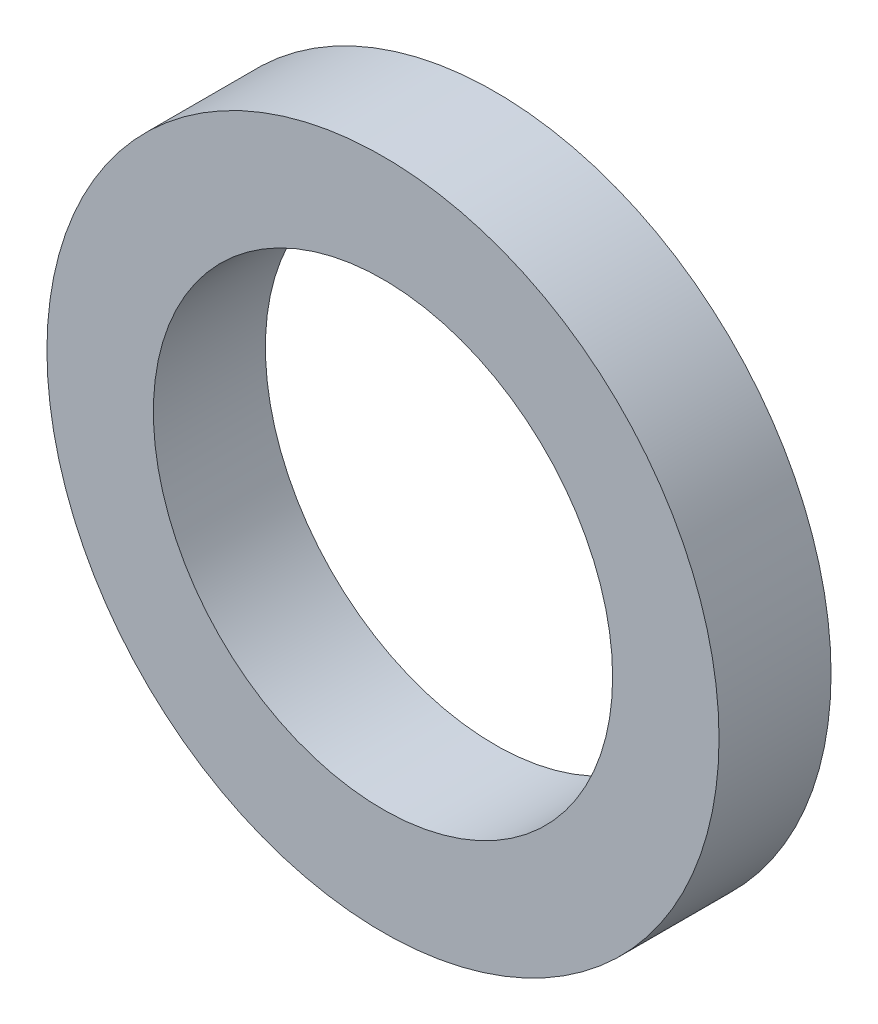
ISO-10303-21;
HEADER;
FILE_DESCRIPTION(('STEP AP214'),'2;1');
FILE_NAME('part.step','',(''),(''),'','','');
FILE_SCHEMA(('AUTOMOTIVE_DESIGN { 1 0 10303 214 1 1 1 1 }'));
ENDSEC;
DATA;
#1=APPLICATION_CONTEXT('core data for automotive mechanical design processes');
#2=APPLICATION_PROTOCOL_DEFINITION('international standard','automotive_design',2000,#1);
#3=PRODUCT_CONTEXT('',#1,'mechanical');
#4=PRODUCT('Part','Part','',(#3));
#5=PRODUCT_RELATED_PRODUCT_CATEGORY('part','',(#4));
#6=PRODUCT_DEFINITION_FORMATION('','',#4);
#7=PRODUCT_DEFINITION_CONTEXT('part definition',#1,'design');
#8=PRODUCT_DEFINITION('design','',#6,#7);
#9=PRODUCT_DEFINITION_SHAPE('','',#8);
#10=(LENGTH_UNIT() NAMED_UNIT(*) SI_UNIT(.MILLI.,.METRE.));
#11=(NAMED_UNIT(*) PLANE_ANGLE_UNIT() SI_UNIT($,.RADIAN.));
#12=(NAMED_UNIT(*) SI_UNIT($,.STERADIAN.) SOLID_ANGLE_UNIT());
#13=UNCERTAINTY_MEASURE_WITH_UNIT(LENGTH_MEASURE(1.E-05),#10,'distance_accuracy_value','');
#14=(GEOMETRIC_REPRESENTATION_CONTEXT(3) GLOBAL_UNCERTAINTY_ASSIGNED_CONTEXT((#13)) GLOBAL_UNIT_ASSIGNED_CONTEXT((#10,
#11,#12)) REPRESENTATION_CONTEXT('',''));
#15=CARTESIAN_POINT('',(0.,0.,0.));
#16=DIRECTION('',(0.,0.,1.));
#17=DIRECTION('',(1.,0.,0.));
#18=AXIS2_PLACEMENT_3D('',#15,#16,#17);
#19=CARTESIAN_POINT('',(0.,0.,2.));
#20=DIRECTION('',(0.,0.,1.));
#21=DIRECTION('',(1.,0.,0.));
#22=AXIS2_PLACEMENT_3D('',#19,#20,#21);
#23=PLANE('',#22);
#24=CARTESIAN_POINT('',(0.,0.,2.));
#25=DIRECTION('',(0.,0.,1.));
#26=DIRECTION('',(1.,0.,0.));
#27=AXIS2_PLACEMENT_3D('',#24,#25,#26);
#28=CIRCLE('',#27,6.);
#29=CARTESIAN_POINT('',(6.,0.,2.));
#30=VERTEX_POINT('',#29);
#31=EDGE_CURVE('E10',#30,#30,#28,.T.);
#32=ORIENTED_EDGE('',*,*,#31,.T.);
#33=EDGE_LOOP('',(#32));
#34=FACE_BOUND('',#33,.T.);
#35=CARTESIAN_POINT('',(0.,0.,2.));
#36=DIRECTION('',(0.,0.,1.));
#37=DIRECTION('',(1.,0.,0.));
#38=AXIS2_PLACEMENT_3D('',#35,#36,#37);
#39=CIRCLE('',#38,4.1);
#40=CARTESIAN_POINT('',(4.1,0.,2.));
#41=VERTEX_POINT('',#40);
#42=EDGE_CURVE('E50',#41,#41,#39,.T.);
#43=ORIENTED_EDGE('',*,*,#42,.F.);
#44=EDGE_LOOP('',(#43));
#45=FACE_BOUND('',#44,.T.);
#46=ADVANCED_FACE('F37',(#34,#45),#23,.T.);
#47=CARTESIAN_POINT('',(0.,0.,0.));
#48=DIRECTION('',(0.,0.,1.));
#49=DIRECTION('',(1.,0.,0.));
#50=AXIS2_PLACEMENT_3D('',#47,#48,#49);
#51=PLANE('',#50);
#52=CARTESIAN_POINT('',(0.,0.,0.));
#53=DIRECTION('',(0.,0.,1.));
#54=DIRECTION('',(1.,0.,0.));
#55=AXIS2_PLACEMENT_3D('',#52,#53,#54);
#56=CIRCLE('',#55,6.);
#57=CARTESIAN_POINT('',(6.,0.,0.));
#58=VERTEX_POINT('',#57);
#59=EDGE_CURVE('E41',#58,#58,#56,.T.);
#60=ORIENTED_EDGE('',*,*,#59,.F.);
#61=EDGE_LOOP('',(#60));
#62=FACE_BOUND('',#61,.T.);
#63=CARTESIAN_POINT('',(0.,0.,0.));
#64=DIRECTION('',(0.,0.,1.));
#65=DIRECTION('',(1.,0.,0.));
#66=AXIS2_PLACEMENT_3D('',#63,#64,#65);
#67=CIRCLE('',#66,4.1);
#68=CARTESIAN_POINT('',(4.1,0.,0.));
#69=VERTEX_POINT('',#68);
#70=EDGE_CURVE('E52',#69,#69,#67,.T.);
#71=ORIENTED_EDGE('',*,*,#70,.T.);
#72=EDGE_LOOP('',(#71));
#73=FACE_BOUND('',#72,.T.);
#74=ADVANCED_FACE('F64',(#62,#73),#51,.F.);
#75=CARTESIAN_POINT('',(0.,0.,2.));
#76=DIRECTION('',(0.,0.,-1.));
#77=DIRECTION('',(-1.,0.,0.));
#78=AXIS2_PLACEMENT_3D('',#75,#76,#77);
#79=CYLINDRICAL_SURFACE('',#78,6.);
#80=ORIENTED_EDGE('',*,*,#31,.F.);
#81=EDGE_LOOP('',(#80));
#82=FACE_BOUND('',#81,.T.);
#83=ORIENTED_EDGE('',*,*,#59,.T.);
#84=EDGE_LOOP('',(#83));
#85=FACE_BOUND('',#84,.T.);
#86=ADVANCED_FACE('F39',(#82,#85),#79,.T.);
#87=CARTESIAN_POINT('',(0.,0.,2.));
#88=DIRECTION('',(0.,0.,-1.));
#89=DIRECTION('',(-1.,0.,0.));
#90=AXIS2_PLACEMENT_3D('',#87,#88,#89);
#91=CYLINDRICAL_SURFACE('',#90,4.1);
#92=ORIENTED_EDGE('',*,*,#42,.T.);
#93=EDGE_LOOP('',(#92));
#94=FACE_BOUND('',#93,.T.);
#95=ORIENTED_EDGE('',*,*,#70,.F.);
#96=EDGE_LOOP('',(#95));
#97=FACE_BOUND('',#96,.T.);
#98=ADVANCED_FACE('F60',(#94,#97),#91,.F.);
#99=CLOSED_SHELL('',(#46,#74,#86,#98));
#100=MANIFOLD_SOLID_BREP('B2',#99);
#101=ADVANCED_BREP_SHAPE_REPRESENTATION('',(#18,#100),#14);
#102=SHAPE_DEFINITION_REPRESENTATION(#9,#101);
ENDSEC;
END-ISO-10303-21;
